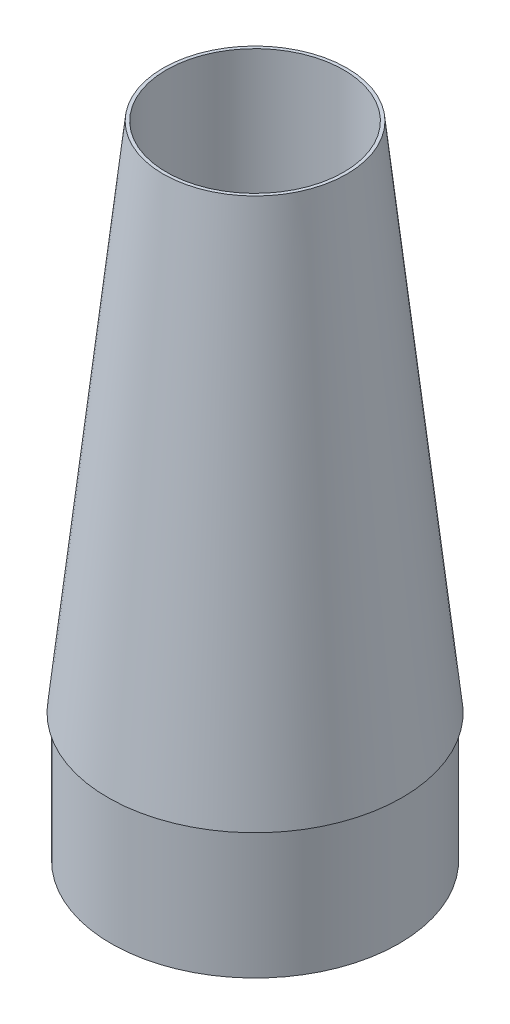
ISO-10303-21;
HEADER;
FILE_DESCRIPTION(('STEP AP214'),'2;1');
FILE_NAME('part.step','',(''),(''),'','','');
FILE_SCHEMA(('AUTOMOTIVE_DESIGN { 1 0 10303 214 1 1 1 1 }'));
ENDSEC;
DATA;
#1=APPLICATION_CONTEXT('core data for automotive mechanical design processes');
#2=APPLICATION_PROTOCOL_DEFINITION('international standard','automotive_design',2000,#1);
#3=PRODUCT_CONTEXT('',#1,'mechanical');
#4=PRODUCT('Part','Part','',(#3));
#5=PRODUCT_RELATED_PRODUCT_CATEGORY('part','',(#4));
#6=PRODUCT_DEFINITION_FORMATION('','',#4);
#7=PRODUCT_DEFINITION_CONTEXT('part definition',#1,'design');
#8=PRODUCT_DEFINITION('design','',#6,#7);
#9=PRODUCT_DEFINITION_SHAPE('','',#8);
#10=(LENGTH_UNIT() NAMED_UNIT(*) SI_UNIT(.MILLI.,.METRE.));
#11=(NAMED_UNIT(*) PLANE_ANGLE_UNIT() SI_UNIT($,.RADIAN.));
#12=(NAMED_UNIT(*) SI_UNIT($,.STERADIAN.) SOLID_ANGLE_UNIT());
#13=UNCERTAINTY_MEASURE_WITH_UNIT(LENGTH_MEASURE(1.E-05),#10,'distance_accuracy_value','');
#14=(GEOMETRIC_REPRESENTATION_CONTEXT(3) GLOBAL_UNCERTAINTY_ASSIGNED_CONTEXT((#13)) GLOBAL_UNIT_ASSIGNED_CONTEXT((#10,
#11,#12)) REPRESENTATION_CONTEXT('',''));
#15=CARTESIAN_POINT('',(0.,0.,0.));
#16=DIRECTION('',(0.,0.,1.));
#17=DIRECTION('',(1.,0.,0.));
#18=AXIS2_PLACEMENT_3D('',#15,#16,#17);
#19=CARTESIAN_POINT('',(87.5284,381.,0.));
#20=DIRECTION('',(0.,-1.,0.));
#21=DIRECTION('',(1.,0.,0.));
#22=AXIS2_PLACEMENT_3D('',#19,#20,#21);
#23=CONICAL_SURFACE('',#22,54.65318,0.107442974957993);
#24=CARTESIAN_POINT('',(87.5284,76.2,0.));
#25=DIRECTION('',(0.,-1.,0.));
#26=DIRECTION('',(1.,0.,0.));
#27=AXIS2_PLACEMENT_3D('',#24,#25,#26);
#28=CIRCLE('',#27,87.5284);
#29=CARTESIAN_POINT('',(175.0568,76.2,0.));
#30=VERTEX_POINT('',#29);
#31=EDGE_CURVE('E48',#30,#30,#28,.F.);
#32=ORIENTED_EDGE('',*,*,#31,.T.);
#33=EDGE_LOOP('',(#32));
#34=FACE_BOUND('',#33,.T.);
#35=CARTESIAN_POINT('',(87.5284,381.,0.));
#36=DIRECTION('',(0.,1.,0.));
#37=DIRECTION('',(-1.,0.,0.));
#38=AXIS2_PLACEMENT_3D('',#35,#36,#37);
#39=CIRCLE('',#38,54.65318);
#40=CARTESIAN_POINT('',(32.87522,381.,0.));
#41=VERTEX_POINT('',#40);
#42=EDGE_CURVE('E11',#41,#41,#39,.T.);
#43=ORIENTED_EDGE('',*,*,#42,.F.);
#44=EDGE_LOOP('',(#43));
#45=FACE_BOUND('',#44,.T.);
#46=ADVANCED_FACE('F32',(#34,#45),#23,.T.);
#47=CARTESIAN_POINT('',(32.87522,381.,0.));
#48=DIRECTION('',(0.,1.,0.));
#49=DIRECTION('',(-1.,0.,0.));
#50=AXIS2_PLACEMENT_3D('',#47,#48,#49);
#51=PLANE('',#50);
#52=CARTESIAN_POINT('',(87.5284,381.,0.));
#53=DIRECTION('',(0.,1.,0.));
#54=DIRECTION('',(-1.,0.,0.));
#55=AXIS2_PLACEMENT_3D('',#52,#53,#54);
#56=CIRCLE('',#55,52.74818);
#57=CARTESIAN_POINT('',(34.78022,381.,0.));
#58=VERTEX_POINT('',#57);
#59=EDGE_CURVE('E43',#58,#58,#56,.T.);
#60=ORIENTED_EDGE('',*,*,#59,.F.);
#61=EDGE_LOOP('',(#60));
#62=FACE_BOUND('',#61,.T.);
#63=ORIENTED_EDGE('',*,*,#42,.T.);
#64=EDGE_LOOP('',(#63));
#65=FACE_BOUND('',#64,.T.);
#66=ADVANCED_FACE('F76',(#62,#65),#51,.T.);
#67=CARTESIAN_POINT('',(87.5284,177.8,0.));
#68=DIRECTION('',(0.,1.,0.));
#69=DIRECTION('',(-1.,0.,0.));
#70=AXIS2_PLACEMENT_3D('',#67,#68,#69);
#71=CYLINDRICAL_SURFACE('',#70,52.74818);
#72=CARTESIAN_POINT('',(87.5284,177.8,0.));
#73=DIRECTION('',(0.,1.,0.));
#74=DIRECTION('',(-1.,0.,0.));
#75=AXIS2_PLACEMENT_3D('',#72,#73,#74);
#76=CIRCLE('',#75,52.74818);
#77=CARTESIAN_POINT('',(34.78022,177.8,0.));
#78=VERTEX_POINT('',#77);
#79=EDGE_CURVE('E39',#78,#78,#76,.T.);
#80=ORIENTED_EDGE('',*,*,#79,.F.);
#81=EDGE_LOOP('',(#80));
#82=FACE_BOUND('',#81,.T.);
#83=ORIENTED_EDGE('',*,*,#59,.T.);
#84=EDGE_LOOP('',(#83));
#85=FACE_BOUND('',#84,.T.);
#86=ADVANCED_FACE('F72',(#82,#85),#71,.F.);
#87=CARTESIAN_POINT('',(87.5284,177.8,0.));
#88=DIRECTION('',(0.,1.,0.));
#89=DIRECTION('',(-1.,0.,0.));
#90=AXIS2_PLACEMENT_3D('',#87,#88,#89);
#91=PLANE('',#90);
#92=ORIENTED_EDGE('',*,*,#79,.T.);
#93=EDGE_LOOP('',(#92));
#94=FACE_BOUND('',#93,.T.);
#95=ADVANCED_FACE('F64',(#94),#91,.T.);
#96=CARTESIAN_POINT('',(87.5284,76.2,0.));
#97=DIRECTION('',(0.,-1.,0.));
#98=DIRECTION('',(1.,0.,0.));
#99=AXIS2_PLACEMENT_3D('',#96,#97,#98);
#100=PLANE('',#99);
#101=ORIENTED_EDGE('',*,*,#31,.F.);
#102=EDGE_LOOP('',(#101));
#103=FACE_BOUND('',#102,.T.);
#104=CARTESIAN_POINT('',(87.5284,76.2,0.));
#105=DIRECTION('',(0.,-1.,0.));
#106=DIRECTION('',(1.,0.,0.));
#107=AXIS2_PLACEMENT_3D('',#104,#105,#106);
#108=CIRCLE('',#107,85.6234);
#109=CARTESIAN_POINT('',(173.1518,76.2,0.));
#110=VERTEX_POINT('',#109);
#111=EDGE_CURVE('E52',#110,#110,#108,.T.);
#112=ORIENTED_EDGE('',*,*,#111,.F.);
#113=EDGE_LOOP('',(#112));
#114=FACE_BOUND('',#113,.T.);
#115=ADVANCED_FACE('F62',(#103,#114),#100,.T.);
#116=CARTESIAN_POINT('',(87.5284,76.2,0.));
#117=DIRECTION('',(0.,-1.,0.));
#118=DIRECTION('',(1.,0.,0.));
#119=AXIS2_PLACEMENT_3D('',#116,#117,#118);
#120=CYLINDRICAL_SURFACE('',#119,85.6234);
#121=CARTESIAN_POINT('',(87.5284,0.,0.));
#122=DIRECTION('',(0.,-1.,0.));
#123=DIRECTION('',(1.,0.,0.));
#124=AXIS2_PLACEMENT_3D('',#121,#122,#123);
#125=CIRCLE('',#124,85.6234);
#126=CARTESIAN_POINT('',(173.1518,0.,0.));
#127=VERTEX_POINT('',#126);
#128=EDGE_CURVE('E53',#127,#127,#125,.T.);
#129=CARTESIAN_POINT('',(173.1518,76.2,0.));
#130=CARTESIAN_POINT('',(173.1518,75.40625,0.));
#131=CARTESIAN_POINT('',(173.1518,74.6125,0.));
#132=CARTESIAN_POINT('',(173.1518,73.025,0.));
#133=CARTESIAN_POINT('',(173.1518,72.23125,0.));
#134=CARTESIAN_POINT('',(173.1518,70.64375,0.));
#135=CARTESIAN_POINT('',(173.1518,69.85,0.));
#136=CARTESIAN_POINT('',(173.1518,68.2625,0.));
#137=CARTESIAN_POINT('',(173.1518,67.46875,0.));
#138=CARTESIAN_POINT('',(173.1518,65.88125,0.));
#139=CARTESIAN_POINT('',(173.1518,65.0875,0.));
#140=CARTESIAN_POINT('',(173.1518,63.5,0.));
#141=CARTESIAN_POINT('',(173.1518,62.70625,0.));
#142=CARTESIAN_POINT('',(173.1518,61.11875,0.));
#143=CARTESIAN_POINT('',(173.1518,60.325,0.));
#144=CARTESIAN_POINT('',(173.1518,58.7375,0.));
#145=CARTESIAN_POINT('',(173.1518,57.94375,0.));
#146=CARTESIAN_POINT('',(173.1518,56.35625,0.));
#147=CARTESIAN_POINT('',(173.1518,55.5625,0.));
#148=CARTESIAN_POINT('',(173.1518,53.975,0.));
#149=CARTESIAN_POINT('',(173.1518,53.18125,0.));
#150=CARTESIAN_POINT('',(173.1518,51.59375,0.));
#151=CARTESIAN_POINT('',(173.1518,50.8,0.));
#152=CARTESIAN_POINT('',(173.1518,49.2125,0.));
#153=CARTESIAN_POINT('',(173.1518,48.41875,0.));
#154=CARTESIAN_POINT('',(173.1518,46.83125,0.));
#155=CARTESIAN_POINT('',(173.1518,46.0375,0.));
#156=CARTESIAN_POINT('',(173.1518,44.45,0.));
#157=CARTESIAN_POINT('',(173.1518,43.65625,0.));
#158=CARTESIAN_POINT('',(173.1518,42.06875,0.));
#159=CARTESIAN_POINT('',(173.1518,41.275,0.));
#160=CARTESIAN_POINT('',(173.1518,39.6875,0.));
#161=CARTESIAN_POINT('',(173.1518,38.89375,0.));
#162=CARTESIAN_POINT('',(173.1518,37.30625,0.));
#163=CARTESIAN_POINT('',(173.1518,36.5125,0.));
#164=CARTESIAN_POINT('',(173.1518,34.925,0.));
#165=CARTESIAN_POINT('',(173.1518,34.13125,0.));
#166=CARTESIAN_POINT('',(173.1518,32.54375,0.));
#167=CARTESIAN_POINT('',(173.1518,31.75,0.));
#168=CARTESIAN_POINT('',(173.1518,30.1625,0.));
#169=CARTESIAN_POINT('',(173.1518,29.36875,0.));
#170=CARTESIAN_POINT('',(173.1518,27.78125,0.));
#171=CARTESIAN_POINT('',(173.1518,26.9875,0.));
#172=CARTESIAN_POINT('',(173.1518,25.4,0.));
#173=CARTESIAN_POINT('',(173.1518,24.60625,0.));
#174=CARTESIAN_POINT('',(173.1518,23.01875,0.));
#175=CARTESIAN_POINT('',(173.1518,22.225,0.));
#176=CARTESIAN_POINT('',(173.1518,20.6375,0.));
#177=CARTESIAN_POINT('',(173.1518,19.84375,0.));
#178=CARTESIAN_POINT('',(173.1518,18.25625,0.));
#179=CARTESIAN_POINT('',(173.1518,17.4625,0.));
#180=CARTESIAN_POINT('',(173.1518,15.875,0.));
#181=CARTESIAN_POINT('',(173.1518,15.08125,0.));
#182=CARTESIAN_POINT('',(173.1518,13.49375,0.));
#183=CARTESIAN_POINT('',(173.1518,12.7,0.));
#184=CARTESIAN_POINT('',(173.1518,11.1125,0.));
#185=CARTESIAN_POINT('',(173.1518,10.31875,0.));
#186=CARTESIAN_POINT('',(173.1518,8.73125000000003,0.));
#187=CARTESIAN_POINT('',(173.1518,7.93750000000003,0.));
#188=CARTESIAN_POINT('',(173.1518,6.35000000000003,0.));
#189=CARTESIAN_POINT('',(173.1518,5.55625000000003,0.));
#190=CARTESIAN_POINT('',(173.1518,3.96875000000003,0.));
#191=CARTESIAN_POINT('',(173.1518,3.17500000000003,0.));
#192=CARTESIAN_POINT('',(173.1518,1.58750000000003,0.));
#193=CARTESIAN_POINT('',(173.1518,0.793750000000028,0.));
#194=CARTESIAN_POINT('',(173.1518,0.,0.));
#195=B_SPLINE_CURVE_WITH_KNOTS('',3,(#129,#130,#131,#132,#133,#134,#135,#136,#137,#138,#139,
#140,#141,#142,#143,#144,#145,#146,#147,#148,#149,#150,#151,#152,#153,#154,#155,#156,#157,#158,
#159,#160,#161,#162,#163,#164,#165,#166,#167,#168,#169,#170,#171,#172,#173,#174,#175,#176,#177,
#178,#179,#180,#181,#182,#183,#184,#185,#186,#187,#188,#189,#190,#191,#192,#193,#194),
.UNSPECIFIED.,.F.,.F.,(4,2,2,2,2,2,2,2,2,2,2,2,2,2,2,2,2,2,2,2,2,2,2,2,2,2,2,2,2,2,2,2,4),(0.,
2.38124999999999,4.76249999999999,7.14374999999999,9.52499999999999,11.90625,14.2875,16.66875,
19.05,21.43125,23.8125,26.19375,28.575,30.95625,33.3375,35.71875,38.1,40.48125,42.8625,45.24375,
47.625,50.00625,52.3875,54.76875,57.15,59.53125,61.9125,64.29375,66.675,69.05625,71.4375,
73.81875,76.2),.UNSPECIFIED.);
#196=EDGE_CURVE('BSEAM59',#110,#127,#195,.T.);
#197=ORIENTED_EDGE('',*,*,#111,.T.);
#198=ORIENTED_EDGE('',*,*,#128,.F.);
#199=ORIENTED_EDGE('',*,*,#196,.T.);
#200=ORIENTED_EDGE('',*,*,#196,.F.);
#201=EDGE_LOOP('',(#197,#199,#198,#200));
#202=FACE_BOUND('',#201,.T.);
#203=ADVANCED_FACE('F59',(#202),#120,.T.);
#204=CARTESIAN_POINT('',(87.5284,0.,0.));
#205=DIRECTION('',(0.,-1.,0.));
#206=DIRECTION('',(1.,0.,0.));
#207=AXIS2_PLACEMENT_3D('',#204,#205,#206);
#208=PLANE('',#207);
#209=ORIENTED_EDGE('',*,*,#128,.T.);
#210=EDGE_LOOP('',(#209));
#211=FACE_BOUND('',#210,.T.);
#212=ADVANCED_FACE('F34',(#211),#208,.T.);
#213=CLOSED_SHELL('',(#46,#66,#86,#95,#115,#203,#212));
#214=MANIFOLD_SOLID_BREP('B2',#213);
#215=ADVANCED_BREP_SHAPE_REPRESENTATION('',(#18,#214),#14);
#216=SHAPE_DEFINITION_REPRESENTATION(#9,#215);
ENDSEC;
END-ISO-10303-21;
